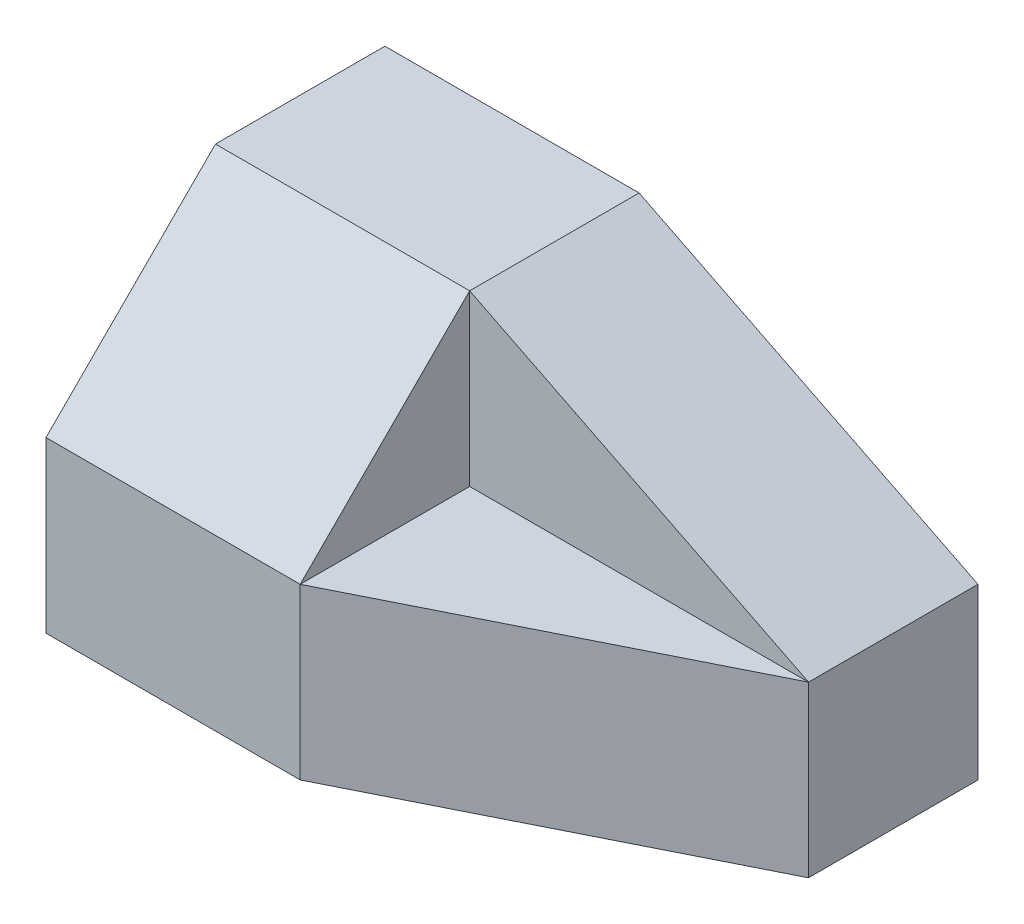
ISO-10303-21;
HEADER;
FILE_DESCRIPTION(('STEP AP214'),'2;1');
FILE_NAME('part.step','',(''),(''),'','','');
FILE_SCHEMA(('AUTOMOTIVE_DESIGN { 1 0 10303 214 1 1 1 1 }'));
ENDSEC;
DATA;
#1=APPLICATION_CONTEXT('core data for automotive mechanical design processes');
#2=APPLICATION_PROTOCOL_DEFINITION('international standard','automotive_design',2000,#1);
#3=PRODUCT_CONTEXT('',#1,'mechanical');
#4=PRODUCT('Part','Part','',(#3));
#5=PRODUCT_RELATED_PRODUCT_CATEGORY('part','',(#4));
#6=PRODUCT_DEFINITION_FORMATION('','',#4);
#7=PRODUCT_DEFINITION_CONTEXT('part definition',#1,'design');
#8=PRODUCT_DEFINITION('design','',#6,#7);
#9=PRODUCT_DEFINITION_SHAPE('','',#8);
#10=(LENGTH_UNIT() NAMED_UNIT(*) SI_UNIT(.MILLI.,.METRE.));
#11=(NAMED_UNIT(*) PLANE_ANGLE_UNIT() SI_UNIT($,.RADIAN.));
#12=(NAMED_UNIT(*) SI_UNIT($,.STERADIAN.) SOLID_ANGLE_UNIT());
#13=UNCERTAINTY_MEASURE_WITH_UNIT(LENGTH_MEASURE(1.E-05),#10,'distance_accuracy_value','');
#14=(GEOMETRIC_REPRESENTATION_CONTEXT(3) GLOBAL_UNCERTAINTY_ASSIGNED_CONTEXT((#13)) GLOBAL_UNIT_ASSIGNED_CONTEXT((#10,
#11,#12)) REPRESENTATION_CONTEXT('',''));
#15=CARTESIAN_POINT('',(0.,0.,0.));
#16=DIRECTION('',(0.,0.,1.));
#17=DIRECTION('',(1.,0.,0.));
#18=AXIS2_PLACEMENT_3D('',#15,#16,#17);
#19=CARTESIAN_POINT('',(0.,2.,0.));
#20=DIRECTION('',(0.,-1.,0.));
#21=DIRECTION('',(0.,0.,-1.));
#22=AXIS2_PLACEMENT_3D('',#19,#20,#21);
#23=PLANE('',#22);
#24=DIRECTION('',(0.,0.,1.));
#25=VECTOR('',#24,1.);
#26=CARTESIAN_POINT('',(3.,2.,0.));
#27=LINE('',#26,#25);
#28=CARTESIAN_POINT('',(3.,2.,-2.));
#29=VERTEX_POINT('',#28);
#30=CARTESIAN_POINT('',(3.,2.,0.));
#31=VERTEX_POINT('',#30);
#32=EDGE_CURVE('E96',#29,#31,#27,.T.);
#33=ORIENTED_EDGE('',*,*,#32,.T.);
#34=DIRECTION('',(0.894427190999916,0.,-0.447213595499958));
#35=VECTOR('',#34,1.);
#36=CARTESIAN_POINT('',(7.,2.,-2.));
#37=LINE('',#36,#35);
#38=CARTESIAN_POINT('',(7.,2.,-2.));
#39=VERTEX_POINT('',#38);
#40=EDGE_CURVE('E116',#31,#39,#37,.T.);
#41=ORIENTED_EDGE('',*,*,#40,.T.);
#42=DIRECTION('',(-1.,0.,0.));
#43=VECTOR('',#42,1.);
#44=CARTESIAN_POINT('',(3.,2.,-2.));
#45=LINE('',#44,#43);
#46=EDGE_CURVE('E110',#39,#29,#45,.T.);
#47=ORIENTED_EDGE('',*,*,#46,.T.);
#48=EDGE_LOOP('',(#33,#41,#47));
#49=FACE_BOUND('',#48,.T.);
#50=ADVANCED_FACE('F35',(#49),#23,.F.);
#51=CARTESIAN_POINT('',(3.,4.,-2.));
#52=DIRECTION('',(0.,0.,1.));
#53=DIRECTION('',(1.,0.,0.));
#54=AXIS2_PLACEMENT_3D('',#51,#52,#53);
#55=PLANE('',#54);
#56=DIRECTION('',(0.894427190999916,-0.447213595499958,0.));
#57=VECTOR('',#56,1.);
#58=CARTESIAN_POINT('',(7.,2.,-2.));
#59=LINE('',#58,#57);
#60=CARTESIAN_POINT('',(3.,4.,-2.));
#61=VERTEX_POINT('',#60);
#62=EDGE_CURVE('E112',#61,#39,#59,.T.);
#63=ORIENTED_EDGE('',*,*,#62,.F.);
#64=DIRECTION('',(0.,-1.,0.));
#65=VECTOR('',#64,1.);
#66=CARTESIAN_POINT('',(3.,2.,-2.));
#67=LINE('',#66,#65);
#68=EDGE_CURVE('E99',#61,#29,#67,.T.);
#69=ORIENTED_EDGE('',*,*,#68,.T.);
#70=ORIENTED_EDGE('',*,*,#46,.F.);
#71=EDGE_LOOP('',(#63,#69,#70));
#72=FACE_BOUND('',#71,.T.);
#73=ADVANCED_FACE('F109',(#72),#55,.T.);
#74=CARTESIAN_POINT('',(3.,2.,0.));
#75=DIRECTION('',(0.,0.,-1.));
#76=DIRECTION('',(-1.,0.,0.));
#77=AXIS2_PLACEMENT_3D('',#74,#75,#76);
#78=PLANE('',#77);
#79=DIRECTION('',(1.,0.,0.));
#80=VECTOR('',#79,1.);
#81=CARTESIAN_POINT('',(3.,0.,0.));
#82=LINE('',#81,#80);
#83=CARTESIAN_POINT('',(0.,0.,0.));
#84=VERTEX_POINT('',#83);
#85=CARTESIAN_POINT('',(3.,0.,0.));
#86=VERTEX_POINT('',#85);
#87=EDGE_CURVE('E135',#84,#86,#82,.T.);
#88=ORIENTED_EDGE('',*,*,#87,.T.);
#89=DIRECTION('',(0.,-1.,0.));
#90=VECTOR('',#89,1.);
#91=CARTESIAN_POINT('',(3.,2.,0.));
#92=LINE('',#91,#90);
#93=EDGE_CURVE('E11',#31,#86,#92,.T.);
#94=ORIENTED_EDGE('',*,*,#93,.F.);
#95=DIRECTION('',(1.,0.,0.));
#96=VECTOR('',#95,1.);
#97=CARTESIAN_POINT('',(3.,2.,0.));
#98=LINE('',#97,#96);
#99=CARTESIAN_POINT('',(0.,2.,0.));
#100=VERTEX_POINT('',#99);
#101=EDGE_CURVE('E129',#100,#31,#98,.T.);
#102=ORIENTED_EDGE('',*,*,#101,.F.);
#103=DIRECTION('',(0.,-1.,0.));
#104=VECTOR('',#103,1.);
#105=CARTESIAN_POINT('',(0.,2.,0.));
#106=LINE('',#105,#104);
#107=EDGE_CURVE('E134',#100,#84,#106,.T.);
#108=ORIENTED_EDGE('',*,*,#107,.T.);
#109=EDGE_LOOP('',(#88,#94,#102,#108));
#110=FACE_BOUND('',#109,.T.);
#111=ADVANCED_FACE('F37',(#110),#78,.F.);
#112=CARTESIAN_POINT('',(7.,2.,-2.));
#113=DIRECTION('',(-0.447213595499958,0.,-0.894427190999916));
#114=DIRECTION('',(-0.894427190999916,0.,0.447213595499958));
#115=AXIS2_PLACEMENT_3D('',#112,#113,#114);
#116=PLANE('',#115);
#117=DIRECTION('',(0.894427190999916,0.,-0.447213595499958));
#118=VECTOR('',#117,1.);
#119=CARTESIAN_POINT('',(7.,0.,-2.));
#120=LINE('',#119,#118);
#121=CARTESIAN_POINT('',(7.,0.,-2.));
#122=VERTEX_POINT('',#121);
#123=EDGE_CURVE('E138',#86,#122,#120,.T.);
#124=ORIENTED_EDGE('',*,*,#123,.T.);
#125=DIRECTION('',(0.,-1.,0.));
#126=VECTOR('',#125,1.);
#127=CARTESIAN_POINT('',(7.,2.,-2.));
#128=LINE('',#127,#126);
#129=EDGE_CURVE('E43',#39,#122,#128,.T.);
#130=ORIENTED_EDGE('',*,*,#129,.F.);
#131=ORIENTED_EDGE('',*,*,#40,.F.);
#132=ORIENTED_EDGE('',*,*,#93,.T.);
#133=EDGE_LOOP('',(#124,#130,#131,#132));
#134=FACE_BOUND('',#133,.T.);
#135=ADVANCED_FACE('F203',(#134),#116,.F.);
#136=CARTESIAN_POINT('',(7.,2.,-4.));
#137=DIRECTION('',(-1.,0.,0.));
#138=DIRECTION('',(0.,0.,1.));
#139=AXIS2_PLACEMENT_3D('',#136,#137,#138);
#140=PLANE('',#139);
#141=DIRECTION('',(0.,0.,-1.));
#142=VECTOR('',#141,1.);
#143=CARTESIAN_POINT('',(7.,0.,-4.));
#144=LINE('',#143,#142);
#145=CARTESIAN_POINT('',(7.,0.,-4.));
#146=VERTEX_POINT('',#145);
#147=EDGE_CURVE('E140',#122,#146,#144,.T.);
#148=ORIENTED_EDGE('',*,*,#147,.T.);
#149=DIRECTION('',(0.,-1.,0.));
#150=VECTOR('',#149,1.);
#151=CARTESIAN_POINT('',(7.,2.,-4.));
#152=LINE('',#151,#150);
#153=CARTESIAN_POINT('',(7.,2.,-4.));
#154=VERTEX_POINT('',#153);
#155=EDGE_CURVE('E147',#154,#146,#152,.T.);
#156=ORIENTED_EDGE('',*,*,#155,.F.);
#157=DIRECTION('',(0.,0.,-1.));
#158=VECTOR('',#157,1.);
#159=CARTESIAN_POINT('',(7.,2.,-4.));
#160=LINE('',#159,#158);
#161=EDGE_CURVE('E132',#39,#154,#160,.T.);
#162=ORIENTED_EDGE('',*,*,#161,.F.);
#163=ORIENTED_EDGE('',*,*,#129,.T.);
#164=EDGE_LOOP('',(#148,#156,#162,#163));
#165=FACE_BOUND('',#164,.T.);
#166=ADVANCED_FACE('F152',(#165),#140,.F.);
#167=CARTESIAN_POINT('',(0.,2.,-4.));
#168=DIRECTION('',(0.,0.,1.));
#169=DIRECTION('',(1.,0.,0.));
#170=AXIS2_PLACEMENT_3D('',#167,#168,#169);
#171=PLANE('',#170);
#172=DIRECTION('',(-1.,0.,0.));
#173=VECTOR('',#172,1.);
#174=CARTESIAN_POINT('',(0.,0.,-4.));
#175=LINE('',#174,#173);
#176=CARTESIAN_POINT('',(0.,0.,-4.));
#177=VERTEX_POINT('',#176);
#178=EDGE_CURVE('E58',#146,#177,#175,.T.);
#179=ORIENTED_EDGE('',*,*,#178,.T.);
#180=DIRECTION('',(0.,-1.,0.));
#181=VECTOR('',#180,1.);
#182=CARTESIAN_POINT('',(0.,2.,-4.));
#183=LINE('',#182,#181);
#184=CARTESIAN_POINT('',(0.,4.,-4.));
#185=VERTEX_POINT('',#184);
#186=EDGE_CURVE('E145',#185,#177,#183,.T.);
#187=ORIENTED_EDGE('',*,*,#186,.F.);
#188=DIRECTION('',(-1.,0.,0.));
#189=VECTOR('',#188,1.);
#190=CARTESIAN_POINT('',(3.,4.,-4.));
#191=LINE('',#190,#189);
#192=CARTESIAN_POINT('',(3.,4.,-4.));
#193=VERTEX_POINT('',#192);
#194=EDGE_CURVE('E122',#193,#185,#191,.T.);
#195=ORIENTED_EDGE('',*,*,#194,.F.);
#196=DIRECTION('',(0.894427190999916,-0.447213595499958,0.));
#197=VECTOR('',#196,1.);
#198=CARTESIAN_POINT('',(7.,2.,-4.));
#199=LINE('',#198,#197);
#200=EDGE_CURVE('E173',#193,#154,#199,.T.);
#201=ORIENTED_EDGE('',*,*,#200,.T.);
#202=ORIENTED_EDGE('',*,*,#155,.T.);
#203=EDGE_LOOP('',(#179,#187,#195,#201,#202));
#204=FACE_BOUND('',#203,.T.);
#205=ADVANCED_FACE('F178',(#204),#171,.F.);
#206=CARTESIAN_POINT('',(0.,2.,0.));
#207=DIRECTION('',(1.,0.,0.));
#208=DIRECTION('',(0.,0.,-1.));
#209=AXIS2_PLACEMENT_3D('',#206,#207,#208);
#210=PLANE('',#209);
#211=ORIENTED_EDGE('',*,*,#107,.F.);
#212=DIRECTION('',(0.,0.707106781186548,-0.707106781186548));
#213=VECTOR('',#212,1.);
#214=CARTESIAN_POINT('',(0.,4.,-2.));
#215=LINE('',#214,#213);
#216=CARTESIAN_POINT('',(0.,4.,-2.));
#217=VERTEX_POINT('',#216);
#218=EDGE_CURVE('E114',#100,#217,#215,.T.);
#219=ORIENTED_EDGE('',*,*,#218,.T.);
#220=DIRECTION('',(0.,0.,-1.));
#221=VECTOR('',#220,1.);
#222=CARTESIAN_POINT('',(0.,4.,-4.));
#223=LINE('',#222,#221);
#224=EDGE_CURVE('E125',#217,#185,#223,.T.);
#225=ORIENTED_EDGE('',*,*,#224,.T.);
#226=ORIENTED_EDGE('',*,*,#186,.T.);
#227=DIRECTION('',(0.,0.,1.));
#228=VECTOR('',#227,1.);
#229=CARTESIAN_POINT('',(0.,0.,0.));
#230=LINE('',#229,#228);
#231=EDGE_CURVE('E50',#177,#84,#230,.T.);
#232=ORIENTED_EDGE('',*,*,#231,.T.);
#233=EDGE_LOOP('',(#211,#219,#225,#226,#232));
#234=FACE_BOUND('',#233,.T.);
#235=ADVANCED_FACE('F161',(#234),#210,.F.);
#236=CARTESIAN_POINT('',(0.,0.,0.));
#237=DIRECTION('',(0.,-1.,0.));
#238=DIRECTION('',(0.,0.,-1.));
#239=AXIS2_PLACEMENT_3D('',#236,#237,#238);
#240=PLANE('',#239);
#241=ORIENTED_EDGE('',*,*,#87,.F.);
#242=ORIENTED_EDGE('',*,*,#231,.F.);
#243=ORIENTED_EDGE('',*,*,#178,.F.);
#244=ORIENTED_EDGE('',*,*,#147,.F.);
#245=ORIENTED_EDGE('',*,*,#123,.F.);
#246=EDGE_LOOP('',(#241,#242,#243,#244,#245));
#247=FACE_BOUND('',#246,.T.);
#248=ADVANCED_FACE('F157',(#247),#240,.T.);
#249=CARTESIAN_POINT('',(3.,4.,-4.));
#250=DIRECTION('',(0.,1.,0.));
#251=DIRECTION('',(0.,0.,1.));
#252=AXIS2_PLACEMENT_3D('',#249,#250,#251);
#253=PLANE('',#252);
#254=ORIENTED_EDGE('',*,*,#224,.F.);
#255=DIRECTION('',(-1.,0.,0.));
#256=VECTOR('',#255,1.);
#257=CARTESIAN_POINT('',(3.,4.,-2.));
#258=LINE('',#257,#256);
#259=EDGE_CURVE('E118',#61,#217,#258,.T.);
#260=ORIENTED_EDGE('',*,*,#259,.F.);
#261=DIRECTION('',(0.,0.,-1.));
#262=VECTOR('',#261,1.);
#263=CARTESIAN_POINT('',(3.,4.,-4.));
#264=LINE('',#263,#262);
#265=EDGE_CURVE('E119',#61,#193,#264,.T.);
#266=ORIENTED_EDGE('',*,*,#265,.T.);
#267=ORIENTED_EDGE('',*,*,#194,.T.);
#268=EDGE_LOOP('',(#254,#260,#266,#267));
#269=FACE_BOUND('',#268,.T.);
#270=ADVANCED_FACE('F170',(#269),#253,.T.);
#271=CARTESIAN_POINT('',(7.,2.,-2.));
#272=DIRECTION('',(0.447213595499958,0.894427190999916,0.));
#273=DIRECTION('',(-0.894427190999916,0.447213595499958,0.));
#274=AXIS2_PLACEMENT_3D('',#271,#272,#273);
#275=PLANE('',#274);
#276=ORIENTED_EDGE('',*,*,#200,.F.);
#277=ORIENTED_EDGE('',*,*,#265,.F.);
#278=ORIENTED_EDGE('',*,*,#62,.T.);
#279=ORIENTED_EDGE('',*,*,#161,.T.);
#280=EDGE_LOOP('',(#276,#277,#278,#279));
#281=FACE_BOUND('',#280,.T.);
#282=ADVANCED_FACE('F180',(#281),#275,.T.);
#283=CARTESIAN_POINT('',(3.,4.,-2.));
#284=DIRECTION('',(0.,0.707106781186547,0.707106781186547));
#285=DIRECTION('',(0.,-0.707106781186548,0.707106781186548));
#286=AXIS2_PLACEMENT_3D('',#283,#284,#285);
#287=PLANE('',#286);
#288=ORIENTED_EDGE('',*,*,#218,.F.);
#289=ORIENTED_EDGE('',*,*,#101,.T.);
#290=DIRECTION('',(0.,0.707106781186548,-0.707106781186548));
#291=VECTOR('',#290,1.);
#292=CARTESIAN_POINT('',(3.,4.,-2.));
#293=LINE('',#292,#291);
#294=EDGE_CURVE('E101',#31,#61,#293,.T.);
#295=ORIENTED_EDGE('',*,*,#294,.T.);
#296=ORIENTED_EDGE('',*,*,#259,.T.);
#297=EDGE_LOOP('',(#288,#289,#295,#296));
#298=FACE_BOUND('',#297,.T.);
#299=ADVANCED_FACE('F166',(#298),#287,.T.);
#300=CARTESIAN_POINT('',(3.,0.,0.));
#301=DIRECTION('',(-1.,0.,0.));
#302=DIRECTION('',(0.,0.,1.));
#303=AXIS2_PLACEMENT_3D('',#300,#301,#302);
#304=PLANE('',#303);
#305=ORIENTED_EDGE('',*,*,#68,.F.);
#306=ORIENTED_EDGE('',*,*,#294,.F.);
#307=ORIENTED_EDGE('',*,*,#32,.F.);
#308=EDGE_LOOP('',(#305,#306,#307));
#309=FACE_BOUND('',#308,.T.);
#310=ADVANCED_FACE('F98',(#309),#304,.F.);
#311=CLOSED_SHELL('',(#50,#73,#111,#135,#166,#205,#235,#248,#270,#282,#299,#310));
#312=MANIFOLD_SOLID_BREP('B2',#311);
#313=ADVANCED_BREP_SHAPE_REPRESENTATION('',(#18,#312),#14);
#314=SHAPE_DEFINITION_REPRESENTATION(#9,#313);
ENDSEC;
END-ISO-10303-21;
